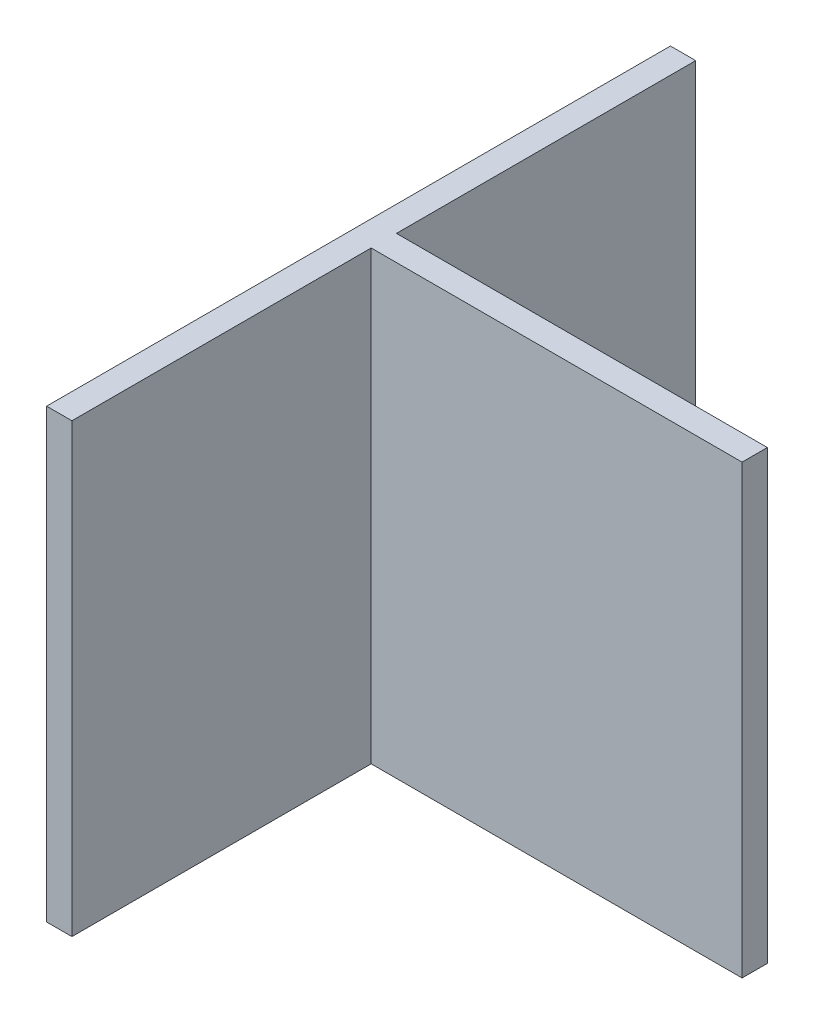
ISO-10303-21;
HEADER;
FILE_DESCRIPTION(('STEP AP214'),'2;1');
FILE_NAME('part.step','',(''),(''),'','','');
FILE_SCHEMA(('AUTOMOTIVE_DESIGN { 1 0 10303 214 1 1 1 1 }'));
ENDSEC;
DATA;
#1=APPLICATION_CONTEXT('core data for automotive mechanical design processes');
#2=APPLICATION_PROTOCOL_DEFINITION('international standard','automotive_design',2000,#1);
#3=PRODUCT_CONTEXT('',#1,'mechanical');
#4=PRODUCT('Part','Part','',(#3));
#5=PRODUCT_RELATED_PRODUCT_CATEGORY('part','',(#4));
#6=PRODUCT_DEFINITION_FORMATION('','',#4);
#7=PRODUCT_DEFINITION_CONTEXT('part definition',#1,'design');
#8=PRODUCT_DEFINITION('design','',#6,#7);
#9=PRODUCT_DEFINITION_SHAPE('','',#8);
#10=(LENGTH_UNIT() NAMED_UNIT(*) SI_UNIT(.MILLI.,.METRE.));
#11=(NAMED_UNIT(*) PLANE_ANGLE_UNIT() SI_UNIT($,.RADIAN.));
#12=(NAMED_UNIT(*) SI_UNIT($,.STERADIAN.) SOLID_ANGLE_UNIT());
#13=UNCERTAINTY_MEASURE_WITH_UNIT(LENGTH_MEASURE(1.E-05),#10,'distance_accuracy_value','');
#14=(GEOMETRIC_REPRESENTATION_CONTEXT(3) GLOBAL_UNCERTAINTY_ASSIGNED_CONTEXT((#13)) GLOBAL_UNIT_ASSIGNED_CONTEXT((#10,
#11,#12)) REPRESENTATION_CONTEXT('',''));
#15=CARTESIAN_POINT('',(0.,0.,0.));
#16=DIRECTION('',(0.,0.,1.));
#17=DIRECTION('',(1.,0.,0.));
#18=AXIS2_PLACEMENT_3D('',#15,#16,#17);
#19=CARTESIAN_POINT('',(0.,2692.4,1879.6));
#20=DIRECTION('',(0.,0.,-1.));
#21=DIRECTION('',(-1.,0.,0.));
#22=AXIS2_PLACEMENT_3D('',#19,#20,#21);
#23=PLANE('',#22);
#24=DIRECTION('',(1.,0.,0.));
#25=VECTOR('',#24,1.);
#26=CARTESIAN_POINT('',(0.,0.,1879.6));
#27=LINE('',#26,#25);
#28=CARTESIAN_POINT('',(-76.2,0.,1879.6));
#29=VERTEX_POINT('',#28);
#30=CARTESIAN_POINT('',(76.2,0.,1879.6));
#31=VERTEX_POINT('',#30);
#32=EDGE_CURVE('E134',#29,#31,#27,.T.);
#33=ORIENTED_EDGE('',*,*,#32,.T.);
#34=DIRECTION('',(0.,-1.,0.));
#35=VECTOR('',#34,1.);
#36=CARTESIAN_POINT('',(76.2,2692.4,1879.6));
#37=LINE('',#36,#35);
#38=CARTESIAN_POINT('',(76.2,2692.4,1879.6));
#39=VERTEX_POINT('',#38);
#40=EDGE_CURVE('E11',#39,#31,#37,.T.);
#41=ORIENTED_EDGE('',*,*,#40,.F.);
#42=DIRECTION('',(1.,0.,0.));
#43=VECTOR('',#42,1.);
#44=CARTESIAN_POINT('',(0.,2692.4,1879.6));
#45=LINE('',#44,#43);
#46=CARTESIAN_POINT('',(-76.2,2692.4,1879.6));
#47=VERTEX_POINT('',#46);
#48=EDGE_CURVE('E152',#47,#39,#45,.T.);
#49=ORIENTED_EDGE('',*,*,#48,.F.);
#50=DIRECTION('',(0.,-1.,0.));
#51=VECTOR('',#50,1.);
#52=CARTESIAN_POINT('',(-76.2,2692.4,1879.6));
#53=LINE('',#52,#51);
#54=EDGE_CURVE('E51',#47,#29,#53,.T.);
#55=ORIENTED_EDGE('',*,*,#54,.T.);
#56=EDGE_LOOP('',(#33,#41,#49,#55));
#57=FACE_BOUND('',#56,.T.);
#58=ADVANCED_FACE('F35',(#57),#23,.F.);
#59=CARTESIAN_POINT('',(76.2,2692.4,0.));
#60=DIRECTION('',(-1.,0.,0.));
#61=DIRECTION('',(0.,0.,1.));
#62=AXIS2_PLACEMENT_3D('',#59,#60,#61);
#63=PLANE('',#62);
#64=DIRECTION('',(0.,0.,-1.));
#65=VECTOR('',#64,1.);
#66=CARTESIAN_POINT('',(76.2,0.,0.));
#67=LINE('',#66,#65);
#68=CARTESIAN_POINT('',(76.2,0.,76.2000000000008));
#69=VERTEX_POINT('',#68);
#70=EDGE_CURVE('E136',#31,#69,#67,.T.);
#71=ORIENTED_EDGE('',*,*,#70,.T.);
#72=DIRECTION('',(0.,-1.,0.));
#73=VECTOR('',#72,1.);
#74=CARTESIAN_POINT('',(76.2,2692.4,76.2000000000008));
#75=LINE('',#74,#73);
#76=CARTESIAN_POINT('',(76.2,2692.4,76.2000000000008));
#77=VERTEX_POINT('',#76);
#78=EDGE_CURVE('E43',#77,#69,#75,.T.);
#79=ORIENTED_EDGE('',*,*,#78,.F.);
#80=DIRECTION('',(0.,0.,-1.));
#81=VECTOR('',#80,1.);
#82=CARTESIAN_POINT('',(76.2,2692.4,0.));
#83=LINE('',#82,#81);
#84=EDGE_CURVE('E89',#39,#77,#83,.T.);
#85=ORIENTED_EDGE('',*,*,#84,.F.);
#86=ORIENTED_EDGE('',*,*,#40,.T.);
#87=EDGE_LOOP('',(#71,#79,#85,#86));
#88=FACE_BOUND('',#87,.T.);
#89=ADVANCED_FACE('F165',(#88),#63,.F.);
#90=CARTESIAN_POINT('',(0.,2692.4,76.2000000000002));
#91=DIRECTION('',(0.,0.,1.));
#92=DIRECTION('',(1.,0.,0.));
#93=AXIS2_PLACEMENT_3D('',#90,#91,#92);
#94=PLANE('',#93);
#95=DIRECTION('',(-1.,0.,0.));
#96=VECTOR('',#95,1.);
#97=CARTESIAN_POINT('',(0.,0.,76.2000000000002));
#98=LINE('',#97,#96);
#99=CARTESIAN_POINT('',(2311.4,0.,76.2000000000014));
#100=VERTEX_POINT('',#99);
#101=EDGE_CURVE('E139',#100,#69,#98,.T.);
#102=ORIENTED_EDGE('',*,*,#101,.F.);
#103=DIRECTION('',(0.,-1.,0.));
#104=VECTOR('',#103,1.);
#105=CARTESIAN_POINT('',(2311.4,2692.4,76.2000000000014));
#106=LINE('',#105,#104);
#107=CARTESIAN_POINT('',(2311.4,2692.4,76.2000000000014));
#108=VERTEX_POINT('',#107);
#109=EDGE_CURVE('E158',#108,#100,#106,.T.);
#110=ORIENTED_EDGE('',*,*,#109,.F.);
#111=DIRECTION('',(-1.,0.,0.));
#112=VECTOR('',#111,1.);
#113=CARTESIAN_POINT('',(0.,2692.4,76.2000000000002));
#114=LINE('',#113,#112);
#115=EDGE_CURVE('E164',#108,#77,#114,.T.);
#116=ORIENTED_EDGE('',*,*,#115,.T.);
#117=ORIENTED_EDGE('',*,*,#78,.T.);
#118=EDGE_LOOP('',(#102,#110,#116,#117));
#119=FACE_BOUND('',#118,.T.);
#120=ADVANCED_FACE('F162',(#119),#94,.T.);
#121=CARTESIAN_POINT('',(2311.4,2692.4,0.));
#122=DIRECTION('',(1.,0.,0.));
#123=DIRECTION('',(0.,0.,-1.));
#124=AXIS2_PLACEMENT_3D('',#121,#122,#123);
#125=PLANE('',#124);
#126=DIRECTION('',(0.,0.,1.));
#127=VECTOR('',#126,1.);
#128=CARTESIAN_POINT('',(2311.4,0.,0.));
#129=LINE('',#128,#127);
#130=CARTESIAN_POINT('',(2311.4,0.,-76.1999999999986));
#131=VERTEX_POINT('',#130);
#132=EDGE_CURVE('E142',#131,#100,#129,.T.);
#133=ORIENTED_EDGE('',*,*,#132,.F.);
#134=DIRECTION('',(0.,-1.,0.));
#135=VECTOR('',#134,1.);
#136=CARTESIAN_POINT('',(2311.4,2692.4,-76.1999999999986));
#137=LINE('',#136,#135);
#138=CARTESIAN_POINT('',(2311.4,2692.4,-76.1999999999986));
#139=VERTEX_POINT('',#138);
#140=EDGE_CURVE('E156',#139,#131,#137,.T.);
#141=ORIENTED_EDGE('',*,*,#140,.F.);
#142=DIRECTION('',(0.,0.,1.));
#143=VECTOR('',#142,1.);
#144=CARTESIAN_POINT('',(2311.4,2692.4,0.));
#145=LINE('',#144,#143);
#146=EDGE_CURVE('E174',#139,#108,#145,.T.);
#147=ORIENTED_EDGE('',*,*,#146,.T.);
#148=ORIENTED_EDGE('',*,*,#109,.T.);
#149=EDGE_LOOP('',(#133,#141,#147,#148));
#150=FACE_BOUND('',#149,.T.);
#151=ADVANCED_FACE('F172',(#150),#125,.T.);
#152=CARTESIAN_POINT('',(0.,2692.4,-76.1999999999997));
#153=DIRECTION('',(0.,0.,1.));
#154=DIRECTION('',(1.,0.,0.));
#155=AXIS2_PLACEMENT_3D('',#152,#153,#154);
#156=PLANE('',#155);
#157=DIRECTION('',(-1.,0.,0.));
#158=VECTOR('',#157,1.);
#159=CARTESIAN_POINT('',(0.,0.,-76.1999999999997));
#160=LINE('',#159,#158);
#161=CARTESIAN_POINT('',(76.2,0.,-76.1999999999992));
#162=VERTEX_POINT('',#161);
#163=EDGE_CURVE('E145',#131,#162,#160,.T.);
#164=ORIENTED_EDGE('',*,*,#163,.T.);
#165=DIRECTION('',(0.,-1.,0.));
#166=VECTOR('',#165,1.);
#167=CARTESIAN_POINT('',(76.2,2692.4,-76.1999999999992));
#168=LINE('',#167,#166);
#169=CARTESIAN_POINT('',(76.2,2692.4,-76.1999999999992));
#170=VERTEX_POINT('',#169);
#171=EDGE_CURVE('E125',#170,#162,#168,.T.);
#172=ORIENTED_EDGE('',*,*,#171,.F.);
#173=DIRECTION('',(-1.,0.,0.));
#174=VECTOR('',#173,1.);
#175=CARTESIAN_POINT('',(0.,2692.4,-76.1999999999997));
#176=LINE('',#175,#174);
#177=EDGE_CURVE('E113',#139,#170,#176,.T.);
#178=ORIENTED_EDGE('',*,*,#177,.F.);
#179=ORIENTED_EDGE('',*,*,#140,.T.);
#180=EDGE_LOOP('',(#164,#172,#178,#179));
#181=FACE_BOUND('',#180,.T.);
#182=ADVANCED_FACE('F197',(#181),#156,.F.);
#183=CARTESIAN_POINT('',(76.2,0.,-1879.6));
#184=VERTEX_POINT('',#183);
#185=EDGE_CURVE('E122',#162,#184,#67,.T.);
#186=ORIENTED_EDGE('',*,*,#185,.T.);
#187=DIRECTION('',(0.,-1.,0.));
#188=VECTOR('',#187,1.);
#189=CARTESIAN_POINT('',(76.2,2692.4,-1879.6));
#190=LINE('',#189,#188);
#191=CARTESIAN_POINT('',(76.2,2692.4,-1879.6));
#192=VERTEX_POINT('',#191);
#193=EDGE_CURVE('E119',#192,#184,#190,.T.);
#194=ORIENTED_EDGE('',*,*,#193,.F.);
#195=EDGE_CURVE('E105',#170,#192,#83,.T.);
#196=ORIENTED_EDGE('',*,*,#195,.F.);
#197=ORIENTED_EDGE('',*,*,#171,.T.);
#198=EDGE_LOOP('',(#186,#194,#196,#197));
#199=FACE_BOUND('',#198,.T.);
#200=ADVANCED_FACE('F120',(#199),#63,.F.);
#201=CARTESIAN_POINT('',(0.,2692.4,-1879.6));
#202=DIRECTION('',(0.,0.,-1.));
#203=DIRECTION('',(-1.,0.,0.));
#204=AXIS2_PLACEMENT_3D('',#201,#202,#203);
#205=PLANE('',#204);
#206=DIRECTION('',(1.,0.,0.));
#207=VECTOR('',#206,1.);
#208=CARTESIAN_POINT('',(0.,0.,-1879.6));
#209=LINE('',#208,#207);
#210=CARTESIAN_POINT('',(-76.2,0.,-1879.6));
#211=VERTEX_POINT('',#210);
#212=EDGE_CURVE('E147',#211,#184,#209,.T.);
#213=ORIENTED_EDGE('',*,*,#212,.F.);
#214=DIRECTION('',(0.,-1.,0.));
#215=VECTOR('',#214,1.);
#216=CARTESIAN_POINT('',(-76.2,2692.4,-1879.6));
#217=LINE('',#216,#215);
#218=CARTESIAN_POINT('',(-76.2,2692.4,-1879.6));
#219=VERTEX_POINT('',#218);
#220=EDGE_CURVE('E77',#219,#211,#217,.T.);
#221=ORIENTED_EDGE('',*,*,#220,.F.);
#222=DIRECTION('',(1.,0.,0.));
#223=VECTOR('',#222,1.);
#224=CARTESIAN_POINT('',(0.,2692.4,-1879.6));
#225=LINE('',#224,#223);
#226=EDGE_CURVE('E110',#219,#192,#225,.T.);
#227=ORIENTED_EDGE('',*,*,#226,.T.);
#228=ORIENTED_EDGE('',*,*,#193,.T.);
#229=EDGE_LOOP('',(#213,#221,#227,#228));
#230=FACE_BOUND('',#229,.T.);
#231=ADVANCED_FACE('F127',(#230),#205,.T.);
#232=CARTESIAN_POINT('',(-76.2,2692.4,0.));
#233=DIRECTION('',(-1.,0.,0.));
#234=DIRECTION('',(0.,0.,1.));
#235=AXIS2_PLACEMENT_3D('',#232,#233,#234);
#236=PLANE('',#235);
#237=DIRECTION('',(0.,0.,-1.));
#238=VECTOR('',#237,1.);
#239=CARTESIAN_POINT('',(-76.2,0.,0.));
#240=LINE('',#239,#238);
#241=EDGE_CURVE('E149',#29,#211,#240,.T.);
#242=ORIENTED_EDGE('',*,*,#241,.F.);
#243=ORIENTED_EDGE('',*,*,#54,.F.);
#244=DIRECTION('',(0.,0.,-1.));
#245=VECTOR('',#244,1.);
#246=CARTESIAN_POINT('',(-76.2,2692.4,0.));
#247=LINE('',#246,#245);
#248=EDGE_CURVE('E128',#47,#219,#247,.T.);
#249=ORIENTED_EDGE('',*,*,#248,.T.);
#250=ORIENTED_EDGE('',*,*,#220,.T.);
#251=EDGE_LOOP('',(#242,#243,#249,#250));
#252=FACE_BOUND('',#251,.T.);
#253=ADVANCED_FACE('F177',(#252),#236,.T.);
#254=CARTESIAN_POINT('',(0.,2692.4,0.));
#255=DIRECTION('',(0.,1.,0.));
#256=DIRECTION('',(0.,0.,1.));
#257=AXIS2_PLACEMENT_3D('',#254,#255,#256);
#258=PLANE('',#257);
#259=ORIENTED_EDGE('',*,*,#48,.T.);
#260=ORIENTED_EDGE('',*,*,#84,.T.);
#261=ORIENTED_EDGE('',*,*,#115,.F.);
#262=ORIENTED_EDGE('',*,*,#146,.F.);
#263=ORIENTED_EDGE('',*,*,#177,.T.);
#264=ORIENTED_EDGE('',*,*,#195,.T.);
#265=ORIENTED_EDGE('',*,*,#226,.F.);
#266=ORIENTED_EDGE('',*,*,#248,.F.);
#267=EDGE_LOOP('',(#259,#260,#261,#262,#263,#264,#265,#266));
#268=FACE_BOUND('',#267,.T.);
#269=ADVANCED_FACE('F107',(#268),#258,.T.);
#270=CARTESIAN_POINT('',(0.,0.,0.));
#271=DIRECTION('',(0.,1.,0.));
#272=DIRECTION('',(0.,0.,1.));
#273=AXIS2_PLACEMENT_3D('',#270,#271,#272);
#274=PLANE('',#273);
#275=ORIENTED_EDGE('',*,*,#32,.F.);
#276=ORIENTED_EDGE('',*,*,#241,.T.);
#277=ORIENTED_EDGE('',*,*,#212,.T.);
#278=ORIENTED_EDGE('',*,*,#185,.F.);
#279=ORIENTED_EDGE('',*,*,#163,.F.);
#280=ORIENTED_EDGE('',*,*,#132,.T.);
#281=ORIENTED_EDGE('',*,*,#101,.T.);
#282=ORIENTED_EDGE('',*,*,#70,.F.);
#283=EDGE_LOOP('',(#275,#276,#277,#278,#279,#280,#281,#282));
#284=FACE_BOUND('',#283,.T.);
#285=ADVANCED_FACE('F168',(#284),#274,.F.);
#286=CLOSED_SHELL('',(#58,#89,#120,#151,#182,#200,#231,#253,#269,#285));
#287=MANIFOLD_SOLID_BREP('B2',#286);
#288=ADVANCED_BREP_SHAPE_REPRESENTATION('',(#18,#287),#14);
#289=SHAPE_DEFINITION_REPRESENTATION(#9,#288);
ENDSEC;
END-ISO-10303-21;
